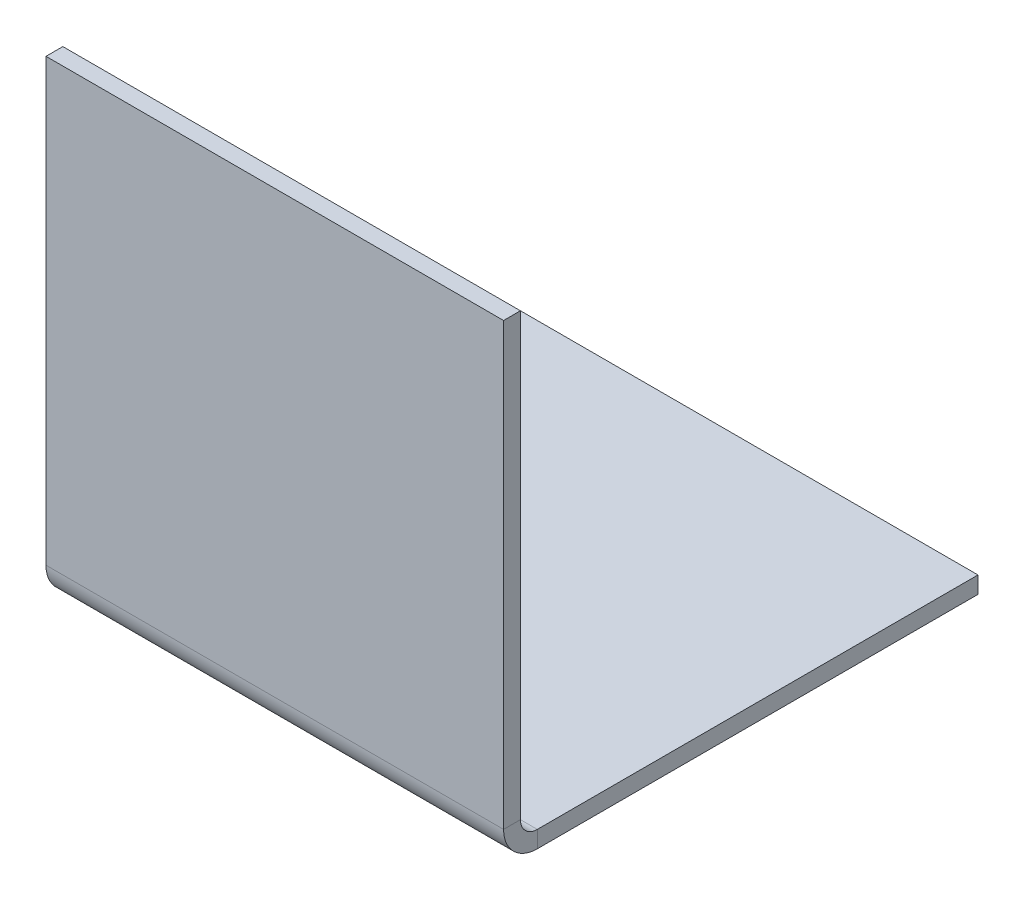
ISO-10303-21;
HEADER;
FILE_DESCRIPTION(('STEP AP214'),'2;1');
FILE_NAME('part.step','',(''),(''),'','','');
FILE_SCHEMA(('AUTOMOTIVE_DESIGN { 1 0 10303 214 1 1 1 1 }'));
ENDSEC;
DATA;
#1=APPLICATION_CONTEXT('core data for automotive mechanical design processes');
#2=APPLICATION_PROTOCOL_DEFINITION('international standard','automotive_design',2000,#1);
#3=PRODUCT_CONTEXT('',#1,'mechanical');
#4=PRODUCT('Part','Part','',(#3));
#5=PRODUCT_RELATED_PRODUCT_CATEGORY('part','',(#4));
#6=PRODUCT_DEFINITION_FORMATION('','',#4);
#7=PRODUCT_DEFINITION_CONTEXT('part definition',#1,'design');
#8=PRODUCT_DEFINITION('design','',#6,#7);
#9=PRODUCT_DEFINITION_SHAPE('','',#8);
#10=(LENGTH_UNIT() NAMED_UNIT(*) SI_UNIT(.MILLI.,.METRE.));
#11=(NAMED_UNIT(*) PLANE_ANGLE_UNIT() SI_UNIT($,.RADIAN.));
#12=(NAMED_UNIT(*) SI_UNIT($,.STERADIAN.) SOLID_ANGLE_UNIT());
#13=UNCERTAINTY_MEASURE_WITH_UNIT(LENGTH_MEASURE(1.E-05),#10,'distance_accuracy_value','');
#14=(GEOMETRIC_REPRESENTATION_CONTEXT(3) GLOBAL_UNCERTAINTY_ASSIGNED_CONTEXT((#13)) GLOBAL_UNIT_ASSIGNED_CONTEXT((#10,
#11,#12)) REPRESENTATION_CONTEXT('',''));
#15=CARTESIAN_POINT('',(0.,0.,0.));
#16=DIRECTION('',(0.,0.,1.));
#17=DIRECTION('',(1.,0.,0.));
#18=AXIS2_PLACEMENT_3D('',#15,#16,#17);
#19=CARTESIAN_POINT('',(10.,-0.7366,10.));
#20=DIRECTION('',(1.,0.,0.));
#21=DIRECTION('',(0.,0.,-1.));
#22=AXIS2_PLACEMENT_3D('',#19,#20,#21);
#23=PLANE('',#22);
#24=DIRECTION('',(0.,0.,-1.));
#25=VECTOR('',#24,1.);
#26=CARTESIAN_POINT('',(10.,0.,10.));
#27=LINE('',#26,#25);
#28=CARTESIAN_POINT('',(10.,0.,9.2634));
#29=VERTEX_POINT('',#28);
#30=CARTESIAN_POINT('',(10.,0.,-10.));
#31=VERTEX_POINT('',#30);
#32=EDGE_CURVE('E86',#29,#31,#27,.T.);
#33=ORIENTED_EDGE('',*,*,#32,.F.);
#34=DIRECTION('',(0.,-1.,0.));
#35=VECTOR('',#34,1.);
#36=CARTESIAN_POINT('',(10.,0.,9.2634));
#37=LINE('',#36,#35);
#38=CARTESIAN_POINT('',(10.,-0.736600000000003,9.2634));
#39=VERTEX_POINT('',#38);
#40=EDGE_CURVE('E95',#29,#39,#37,.T.);
#41=ORIENTED_EDGE('',*,*,#40,.T.);
#42=DIRECTION('',(0.,0.,-1.));
#43=VECTOR('',#42,1.);
#44=CARTESIAN_POINT('',(10.,-0.7366,10.));
#45=LINE('',#44,#43);
#46=CARTESIAN_POINT('',(10.,-0.7366,-10.));
#47=VERTEX_POINT('',#46);
#48=EDGE_CURVE('E82',#39,#47,#45,.T.);
#49=ORIENTED_EDGE('',*,*,#48,.T.);
#50=DIRECTION('',(0.,1.,0.));
#51=VECTOR('',#50,1.);
#52=CARTESIAN_POINT('',(10.,-0.7366,-10.));
#53=LINE('',#52,#51);
#54=EDGE_CURVE('E37',#47,#31,#53,.T.);
#55=ORIENTED_EDGE('',*,*,#54,.T.);
#56=EDGE_LOOP('',(#33,#41,#49,#55));
#57=FACE_BOUND('',#56,.T.);
#58=ADVANCED_FACE('F34',(#57),#23,.T.);
#59=CARTESIAN_POINT('',(0.,-0.7366,0.));
#60=DIRECTION('',(0.,-1.,0.));
#61=DIRECTION('',(0.,0.,-1.));
#62=AXIS2_PLACEMENT_3D('',#59,#60,#61);
#63=PLANE('',#62);
#64=ORIENTED_EDGE('',*,*,#48,.F.);
#65=DIRECTION('',(1.,0.,0.));
#66=VECTOR('',#65,1.);
#67=CARTESIAN_POINT('',(10.,-0.736600000000003,9.2634));
#68=LINE('',#67,#66);
#69=CARTESIAN_POINT('',(-10.,-0.7366,9.2634));
#70=VERTEX_POINT('',#69);
#71=EDGE_CURVE('E112',#39,#70,#68,.F.);
#72=ORIENTED_EDGE('',*,*,#71,.T.);
#73=DIRECTION('',(0.,0.,1.));
#74=VECTOR('',#73,1.);
#75=CARTESIAN_POINT('',(-10.,-0.7366,10.));
#76=LINE('',#75,#74);
#77=CARTESIAN_POINT('',(-10.,-0.7366,-10.));
#78=VERTEX_POINT('',#77);
#79=EDGE_CURVE('E91',#78,#70,#76,.T.);
#80=ORIENTED_EDGE('',*,*,#79,.F.);
#81=DIRECTION('',(-1.,0.,0.));
#82=VECTOR('',#81,1.);
#83=CARTESIAN_POINT('',(-10.,-0.7366,-10.));
#84=LINE('',#83,#82);
#85=EDGE_CURVE('E73',#47,#78,#84,.T.);
#86=ORIENTED_EDGE('',*,*,#85,.F.);
#87=EDGE_LOOP('',(#64,#72,#80,#86));
#88=FACE_BOUND('',#87,.T.);
#89=ADVANCED_FACE('F200',(#88),#63,.T.);
#90=CARTESIAN_POINT('',(0.,0.,0.));
#91=DIRECTION('',(0.,-1.,0.));
#92=DIRECTION('',(0.,0.,-1.));
#93=AXIS2_PLACEMENT_3D('',#90,#91,#92);
#94=PLANE('',#93);
#95=DIRECTION('',(1.,0.,0.));
#96=VECTOR('',#95,1.);
#97=CARTESIAN_POINT('',(10.,0.,9.2634));
#98=LINE('',#97,#96);
#99=CARTESIAN_POINT('',(-10.,0.,9.2634));
#100=VERTEX_POINT('',#99);
#101=EDGE_CURVE('E102',#29,#100,#98,.F.);
#102=ORIENTED_EDGE('',*,*,#101,.F.);
#103=ORIENTED_EDGE('',*,*,#32,.T.);
#104=DIRECTION('',(-1.,0.,0.));
#105=VECTOR('',#104,1.);
#106=CARTESIAN_POINT('',(-10.,0.,-10.));
#107=LINE('',#106,#105);
#108=CARTESIAN_POINT('',(-10.,0.,-10.));
#109=VERTEX_POINT('',#108);
#110=EDGE_CURVE('E71',#31,#109,#107,.T.);
#111=ORIENTED_EDGE('',*,*,#110,.T.);
#112=DIRECTION('',(0.,0.,1.));
#113=VECTOR('',#112,1.);
#114=CARTESIAN_POINT('',(-10.,0.,10.));
#115=LINE('',#114,#113);
#116=EDGE_CURVE('E76',#109,#100,#115,.T.);
#117=ORIENTED_EDGE('',*,*,#116,.T.);
#118=EDGE_LOOP('',(#102,#103,#111,#117));
#119=FACE_BOUND('',#118,.T.);
#120=ADVANCED_FACE('F84',(#119),#94,.F.);
#121=CARTESIAN_POINT('',(-10.,-0.7366,10.));
#122=DIRECTION('',(-1.,0.,0.));
#123=DIRECTION('',(0.,0.,1.));
#124=AXIS2_PLACEMENT_3D('',#121,#122,#123);
#125=PLANE('',#124);
#126=DIRECTION('',(0.,-1.,0.));
#127=VECTOR('',#126,1.);
#128=CARTESIAN_POINT('',(-10.,0.,9.2634));
#129=LINE('',#128,#127);
#130=EDGE_CURVE('E79',#100,#70,#129,.T.);
#131=ORIENTED_EDGE('',*,*,#130,.F.);
#132=ORIENTED_EDGE('',*,*,#116,.F.);
#133=DIRECTION('',(0.,1.,0.));
#134=VECTOR('',#133,1.);
#135=CARTESIAN_POINT('',(-10.,-0.7366,-10.));
#136=LINE('',#135,#134);
#137=EDGE_CURVE('E11',#78,#109,#136,.T.);
#138=ORIENTED_EDGE('',*,*,#137,.F.);
#139=ORIENTED_EDGE('',*,*,#79,.T.);
#140=EDGE_LOOP('',(#131,#132,#138,#139));
#141=FACE_BOUND('',#140,.T.);
#142=ADVANCED_FACE('F77',(#141),#125,.T.);
#143=CARTESIAN_POINT('',(-10.,-0.7366,-10.));
#144=DIRECTION('',(0.,0.,-1.));
#145=DIRECTION('',(-1.,0.,0.));
#146=AXIS2_PLACEMENT_3D('',#143,#144,#145);
#147=PLANE('',#146);
#148=ORIENTED_EDGE('',*,*,#110,.F.);
#149=ORIENTED_EDGE('',*,*,#54,.F.);
#150=ORIENTED_EDGE('',*,*,#85,.T.);
#151=ORIENTED_EDGE('',*,*,#137,.T.);
#152=EDGE_LOOP('',(#148,#149,#150,#151));
#153=FACE_BOUND('',#152,.T.);
#154=ADVANCED_FACE('F68',(#153),#147,.T.);
#155=CARTESIAN_POINT('',(-10.,0.736599999999997,9.2634));
#156=DIRECTION('',(-1.,0.,0.));
#157=DIRECTION('',(0.,0.,1.));
#158=AXIS2_PLACEMENT_3D('',#155,#156,#157);
#159=PLANE('',#158);
#160=DIRECTION('',(0.,0.,1.));
#161=VECTOR('',#160,1.);
#162=CARTESIAN_POINT('',(-10.,0.736599999999997,10.));
#163=LINE('',#162,#161);
#164=CARTESIAN_POINT('',(-10.,0.736599999999997,10.));
#165=VERTEX_POINT('',#164);
#166=CARTESIAN_POINT('',(-10.,0.736599999999997,10.7366));
#167=VERTEX_POINT('',#166);
#168=EDGE_CURVE('E142',#165,#167,#163,.T.);
#169=ORIENTED_EDGE('',*,*,#168,.F.);
#170=CARTESIAN_POINT('',(-10.,0.736599999999997,9.2634));
#171=DIRECTION('',(1.,0.,0.));
#172=DIRECTION('',(0.,0.,-1.));
#173=AXIS2_PLACEMENT_3D('',#170,#171,#172);
#174=CIRCLE('',#173,0.7366);
#175=EDGE_CURVE('E106',#100,#165,#174,.F.);
#176=ORIENTED_EDGE('',*,*,#175,.F.);
#177=ORIENTED_EDGE('',*,*,#130,.T.);
#178=CARTESIAN_POINT('',(-10.,0.736599999999997,9.2634));
#179=DIRECTION('',(1.,0.,0.));
#180=DIRECTION('',(0.,0.,-1.));
#181=AXIS2_PLACEMENT_3D('',#178,#179,#180);
#182=CIRCLE('',#181,1.4732);
#183=EDGE_CURVE('E48',#70,#167,#182,.F.);
#184=ORIENTED_EDGE('',*,*,#183,.T.);
#185=EDGE_LOOP('',(#169,#176,#177,#184));
#186=FACE_BOUND('',#185,.T.);
#187=ADVANCED_FACE('F197',(#186),#159,.T.);
#188=CARTESIAN_POINT('',(10.,0.736599999999997,9.2634));
#189=DIRECTION('',(-1.,0.,0.));
#190=DIRECTION('',(0.,0.,1.));
#191=AXIS2_PLACEMENT_3D('',#188,#189,#190);
#192=PLANE('',#191);
#193=CARTESIAN_POINT('',(10.,0.736599999999997,9.2634));
#194=DIRECTION('',(1.,0.,0.));
#195=DIRECTION('',(0.,0.,-1.));
#196=AXIS2_PLACEMENT_3D('',#193,#194,#195);
#197=CIRCLE('',#196,0.7366);
#198=CARTESIAN_POINT('',(10.,0.736599999999997,10.));
#199=VERTEX_POINT('',#198);
#200=EDGE_CURVE('E99',#199,#29,#197,.T.);
#201=ORIENTED_EDGE('',*,*,#200,.F.);
#202=DIRECTION('',(0.,0.,1.));
#203=VECTOR('',#202,1.);
#204=CARTESIAN_POINT('',(10.,0.736599999999997,10.));
#205=LINE('',#204,#203);
#206=CARTESIAN_POINT('',(10.,0.736599999999997,10.7366));
#207=VERTEX_POINT('',#206);
#208=EDGE_CURVE('E141',#199,#207,#205,.T.);
#209=ORIENTED_EDGE('',*,*,#208,.T.);
#210=CARTESIAN_POINT('',(10.,0.736599999999997,9.2634));
#211=DIRECTION('',(1.,0.,0.));
#212=DIRECTION('',(0.,0.,-1.));
#213=AXIS2_PLACEMENT_3D('',#210,#211,#212);
#214=CIRCLE('',#213,1.4732);
#215=EDGE_CURVE('E109',#207,#39,#214,.T.);
#216=ORIENTED_EDGE('',*,*,#215,.T.);
#217=ORIENTED_EDGE('',*,*,#40,.F.);
#218=EDGE_LOOP('',(#201,#209,#216,#217));
#219=FACE_BOUND('',#218,.T.);
#220=ADVANCED_FACE('F163',(#219),#192,.F.);
#221=CARTESIAN_POINT('',(10.,0.736599999999997,9.2634));
#222=DIRECTION('',(1.,0.,0.));
#223=DIRECTION('',(0.,0.,1.));
#224=AXIS2_PLACEMENT_3D('',#221,#222,#223);
#225=CYLINDRICAL_SURFACE('',#224,1.4732);
#226=ORIENTED_EDGE('',*,*,#71,.F.);
#227=ORIENTED_EDGE('',*,*,#215,.F.);
#228=DIRECTION('',(-1.,0.,0.));
#229=VECTOR('',#228,1.);
#230=CARTESIAN_POINT('',(0.,0.736599999999997,10.7366));
#231=LINE('',#230,#229);
#232=EDGE_CURVE('E132',#207,#167,#231,.T.);
#233=ORIENTED_EDGE('',*,*,#232,.T.);
#234=ORIENTED_EDGE('',*,*,#183,.F.);
#235=EDGE_LOOP('',(#226,#227,#233,#234));
#236=FACE_BOUND('',#235,.T.);
#237=ADVANCED_FACE('F201',(#236),#225,.T.);
#238=CARTESIAN_POINT('',(10.,0.736599999999997,9.2634));
#239=DIRECTION('',(1.,0.,0.));
#240=DIRECTION('',(0.,0.,1.));
#241=AXIS2_PLACEMENT_3D('',#238,#239,#240);
#242=CYLINDRICAL_SURFACE('',#241,0.7366);
#243=ORIENTED_EDGE('',*,*,#101,.T.);
#244=ORIENTED_EDGE('',*,*,#175,.T.);
#245=DIRECTION('',(1.,0.,0.));
#246=VECTOR('',#245,1.);
#247=CARTESIAN_POINT('',(-10.,0.736599999999997,10.));
#248=LINE('',#247,#246);
#249=EDGE_CURVE('E145',#165,#199,#248,.T.);
#250=ORIENTED_EDGE('',*,*,#249,.T.);
#251=ORIENTED_EDGE('',*,*,#200,.T.);
#252=EDGE_LOOP('',(#243,#244,#250,#251));
#253=FACE_BOUND('',#252,.T.);
#254=ADVANCED_FACE('F153',(#253),#242,.F.);
#255=CARTESIAN_POINT('',(-10.,0.,10.7366));
#256=DIRECTION('',(1.,0.,0.));
#257=DIRECTION('',(0.,1.,0.));
#258=AXIS2_PLACEMENT_3D('',#255,#256,#257);
#259=PLANE('',#258);
#260=ORIENTED_EDGE('',*,*,#168,.T.);
#261=DIRECTION('',(0.,-1.,0.));
#262=VECTOR('',#261,1.);
#263=CARTESIAN_POINT('',(-10.,0.,10.7366));
#264=LINE('',#263,#262);
#265=CARTESIAN_POINT('',(-10.,20.,10.7366));
#266=VERTEX_POINT('',#265);
#267=EDGE_CURVE('E125',#266,#167,#264,.T.);
#268=ORIENTED_EDGE('',*,*,#267,.F.);
#269=DIRECTION('',(0.,0.,-1.));
#270=VECTOR('',#269,1.);
#271=CARTESIAN_POINT('',(-10.,20.,10.7366));
#272=LINE('',#271,#270);
#273=CARTESIAN_POINT('',(-10.,20.,10.));
#274=VERTEX_POINT('',#273);
#275=EDGE_CURVE('E118',#266,#274,#272,.T.);
#276=ORIENTED_EDGE('',*,*,#275,.T.);
#277=DIRECTION('',(0.,-1.,0.));
#278=VECTOR('',#277,1.);
#279=CARTESIAN_POINT('',(-10.,0.,10.));
#280=LINE('',#279,#278);
#281=EDGE_CURVE('E129',#274,#165,#280,.T.);
#282=ORIENTED_EDGE('',*,*,#281,.T.);
#283=EDGE_LOOP('',(#260,#268,#276,#282));
#284=FACE_BOUND('',#283,.T.);
#285=ADVANCED_FACE('F184',(#284),#259,.F.);
#286=CARTESIAN_POINT('',(10.,20.,10.7366));
#287=DIRECTION('',(-1.,0.,0.));
#288=DIRECTION('',(0.,-1.,0.));
#289=AXIS2_PLACEMENT_3D('',#286,#287,#288);
#290=PLANE('',#289);
#291=ORIENTED_EDGE('',*,*,#208,.F.);
#292=DIRECTION('',(0.,1.,0.));
#293=VECTOR('',#292,1.);
#294=CARTESIAN_POINT('',(10.,20.,10.));
#295=LINE('',#294,#293);
#296=CARTESIAN_POINT('',(10.,20.,10.));
#297=VERTEX_POINT('',#296);
#298=EDGE_CURVE('E126',#199,#297,#295,.T.);
#299=ORIENTED_EDGE('',*,*,#298,.T.);
#300=DIRECTION('',(0.,0.,-1.));
#301=VECTOR('',#300,1.);
#302=CARTESIAN_POINT('',(10.,20.,10.7366));
#303=LINE('',#302,#301);
#304=CARTESIAN_POINT('',(10.,20.,10.7366));
#305=VERTEX_POINT('',#304);
#306=EDGE_CURVE('E103',#305,#297,#303,.T.);
#307=ORIENTED_EDGE('',*,*,#306,.F.);
#308=DIRECTION('',(0.,1.,0.));
#309=VECTOR('',#308,1.);
#310=CARTESIAN_POINT('',(10.,20.,10.7366));
#311=LINE('',#310,#309);
#312=EDGE_CURVE('E135',#207,#305,#311,.T.);
#313=ORIENTED_EDGE('',*,*,#312,.F.);
#314=EDGE_LOOP('',(#291,#299,#307,#313));
#315=FACE_BOUND('',#314,.T.);
#316=ADVANCED_FACE('F168',(#315),#290,.F.);
#317=CARTESIAN_POINT('',(0.,0.,10.7366));
#318=DIRECTION('',(0.,0.,-1.));
#319=DIRECTION('',(-1.,0.,0.));
#320=AXIS2_PLACEMENT_3D('',#317,#318,#319);
#321=PLANE('',#320);
#322=ORIENTED_EDGE('',*,*,#232,.F.);
#323=ORIENTED_EDGE('',*,*,#312,.T.);
#324=DIRECTION('',(-1.,0.,0.));
#325=VECTOR('',#324,1.);
#326=CARTESIAN_POINT('',(-10.,20.,10.7366));
#327=LINE('',#326,#325);
#328=EDGE_CURVE('E121',#305,#266,#327,.T.);
#329=ORIENTED_EDGE('',*,*,#328,.T.);
#330=ORIENTED_EDGE('',*,*,#267,.T.);
#331=EDGE_LOOP('',(#322,#323,#329,#330));
#332=FACE_BOUND('',#331,.T.);
#333=ADVANCED_FACE('F189',(#332),#321,.F.);
#334=CARTESIAN_POINT('',(0.,0.,10.));
#335=DIRECTION('',(0.,0.,-1.));
#336=DIRECTION('',(-1.,0.,0.));
#337=AXIS2_PLACEMENT_3D('',#334,#335,#336);
#338=PLANE('',#337);
#339=ORIENTED_EDGE('',*,*,#298,.F.);
#340=ORIENTED_EDGE('',*,*,#249,.F.);
#341=ORIENTED_EDGE('',*,*,#281,.F.);
#342=DIRECTION('',(-1.,0.,0.));
#343=VECTOR('',#342,1.);
#344=CARTESIAN_POINT('',(-10.,20.,10.));
#345=LINE('',#344,#343);
#346=EDGE_CURVE('E122',#297,#274,#345,.T.);
#347=ORIENTED_EDGE('',*,*,#346,.F.);
#348=EDGE_LOOP('',(#339,#340,#341,#347));
#349=FACE_BOUND('',#348,.T.);
#350=ADVANCED_FACE('F172',(#349),#338,.T.);
#351=CARTESIAN_POINT('',(-10.,20.,10.7366));
#352=DIRECTION('',(0.,-1.,0.));
#353=DIRECTION('',(0.,0.,-1.));
#354=AXIS2_PLACEMENT_3D('',#351,#352,#353);
#355=PLANE('',#354);
#356=ORIENTED_EDGE('',*,*,#346,.T.);
#357=ORIENTED_EDGE('',*,*,#275,.F.);
#358=ORIENTED_EDGE('',*,*,#328,.F.);
#359=ORIENTED_EDGE('',*,*,#306,.T.);
#360=EDGE_LOOP('',(#356,#357,#358,#359));
#361=FACE_BOUND('',#360,.T.);
#362=ADVANCED_FACE('F177',(#361),#355,.F.);
#363=CLOSED_SHELL('',(#58,#89,#120,#142,#154,#187,#220,#237,#254,#285,#316,#333,#350,#362));
#364=MANIFOLD_SOLID_BREP('B2',#363);
#365=ADVANCED_BREP_SHAPE_REPRESENTATION('',(#18,#364),#14);
#366=SHAPE_DEFINITION_REPRESENTATION(#9,#365);
ENDSEC;
END-ISO-10303-21;
